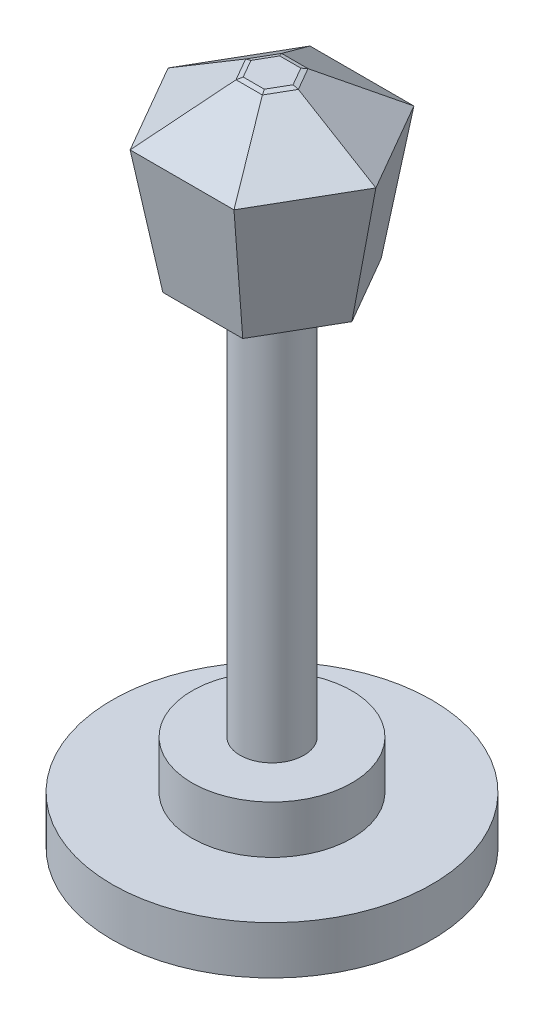
ISO-10303-21;
HEADER;
FILE_DESCRIPTION(('STEP AP214'),'2;1');
FILE_NAME('part.step','',(''),(''),'','','');
FILE_SCHEMA(('AUTOMOTIVE_DESIGN { 1 0 10303 214 1 1 1 1 }'));
ENDSEC;
DATA;
#1=APPLICATION_CONTEXT('core data for automotive mechanical design processes');
#2=APPLICATION_PROTOCOL_DEFINITION('international standard','automotive_design',2000,#1);
#3=PRODUCT_CONTEXT('',#1,'mechanical');
#4=PRODUCT('Part','Part','',(#3));
#5=PRODUCT_RELATED_PRODUCT_CATEGORY('part','',(#4));
#6=PRODUCT_DEFINITION_FORMATION('','',#4);
#7=PRODUCT_DEFINITION_CONTEXT('part definition',#1,'design');
#8=PRODUCT_DEFINITION('design','',#6,#7);
#9=PRODUCT_DEFINITION_SHAPE('','',#8);
#10=(LENGTH_UNIT() NAMED_UNIT(*) SI_UNIT(.MILLI.,.METRE.));
#11=(NAMED_UNIT(*) PLANE_ANGLE_UNIT() SI_UNIT($,.RADIAN.));
#12=(NAMED_UNIT(*) SI_UNIT($,.STERADIAN.) SOLID_ANGLE_UNIT());
#13=UNCERTAINTY_MEASURE_WITH_UNIT(LENGTH_MEASURE(1.E-05),#10,'distance_accuracy_value','');
#14=(GEOMETRIC_REPRESENTATION_CONTEXT(3) GLOBAL_UNCERTAINTY_ASSIGNED_CONTEXT((#13)) GLOBAL_UNIT_ASSIGNED_CONTEXT((#10,
#11,#12)) REPRESENTATION_CONTEXT('',''));
#15=CARTESIAN_POINT('',(0.,0.,0.));
#16=DIRECTION('',(0.,0.,1.));
#17=DIRECTION('',(1.,0.,0.));
#18=AXIS2_PLACEMENT_3D('',#15,#16,#17);
#19=CARTESIAN_POINT('',(-0.989654683712724,42.,-0.571377398046315));
#20=DIRECTION('',(-0.258363888348316,0.954461873656243,-0.149166460486779));
#21=DIRECTION('',(0.5,0.,-0.866025403784439));
#22=AXIS2_PLACEMENT_3D('',#19,#20,#21);
#23=PLANE('',#22);
#24=DIRECTION('',(-0.965261119531429,-0.2612871430456,0.));
#25=VECTOR('',#24,1.);
#26=CARTESIAN_POINT('',(-1.01217624582322,42.0832003748939,0.));
#27=LINE('',#26,#25);
#28=CARTESIAN_POINT('',(-1.31953957828364,42.,0.));
#29=VERTEX_POINT('',#28);
#30=CARTESIAN_POINT('',(-1.64833755289434,41.9109974682634,0.));
#31=VERTEX_POINT('',#30);
#32=EDGE_CURVE('E13',#29,#31,#27,.T.);
#33=ORIENTED_EDGE('',*,*,#32,.F.);
#34=DIRECTION('',(-0.5,0.,0.866025403784439));
#35=VECTOR('',#34,1.);
#36=CARTESIAN_POINT('',(-0.659769789141819,42.,-1.14275479609262));
#37=LINE('',#36,#35);
#38=CARTESIAN_POINT('',(-0.659769789141814,42.,-1.14275479609262));
#39=VERTEX_POINT('',#38);
#40=EDGE_CURVE('E306',#39,#29,#37,.T.);
#41=ORIENTED_EDGE('',*,*,#40,.F.);
#42=DIRECTION('',(-0.482630559765655,-0.261287143045588,-0.835940650799663));
#43=VECTOR('',#42,1.);
#44=CARTESIAN_POINT('',(-0.506088122911614,42.0832003748939,-0.876570341990005));
#45=LINE('',#44,#43);
#46=CARTESIAN_POINT('',(-0.824168776447167,41.9109974682634,-1.42750219481837));
#47=VERTEX_POINT('',#46);
#48=EDGE_CURVE('E72',#39,#47,#45,.T.);
#49=ORIENTED_EDGE('',*,*,#48,.T.);
#50=DIRECTION('',(0.5,0.,-0.866025403784439));
#51=VECTOR('',#50,1.);
#52=CARTESIAN_POINT('',(-0.906368270099853,41.9109974682634,-1.2851284954555));
#53=LINE('',#52,#51);
#54=EDGE_CURVE('E336',#31,#47,#53,.T.);
#55=ORIENTED_EDGE('',*,*,#54,.F.);
#56=EDGE_LOOP('',(#33,#41,#49,#55));
#57=FACE_BOUND('',#56,.T.);
#58=ADVANCED_FACE('F65',(#57),#23,.T.);
#59=CARTESIAN_POINT('',(0.,42.,-1.14275479609262));
#60=DIRECTION('',(0.,0.95446187365625,-0.298332920973534));
#61=DIRECTION('',(1.,0.,0.));
#62=AXIS2_PLACEMENT_3D('',#59,#60,#61);
#63=PLANE('',#62);
#64=ORIENTED_EDGE('',*,*,#48,.F.);
#65=DIRECTION('',(-1.,0.,0.));
#66=VECTOR('',#65,1.);
#67=CARTESIAN_POINT('',(0.659769789141829,42.,-1.14275479609262));
#68=LINE('',#67,#66);
#69=CARTESIAN_POINT('',(0.659769789141829,42.,-1.14275479609262));
#70=VERTEX_POINT('',#69);
#71=EDGE_CURVE('E309',#70,#39,#68,.T.);
#72=ORIENTED_EDGE('',*,*,#71,.F.);
#73=DIRECTION('',(0.482630559765639,-0.261287143045591,-0.835940650799672));
#74=VECTOR('',#73,1.);
#75=CARTESIAN_POINT('',(0.506088122911678,42.0832003748939,-0.876570341990058));
#76=LINE('',#75,#74);
#77=CARTESIAN_POINT('',(0.824168776447168,41.9109974682634,-1.42750219481837));
#78=VERTEX_POINT('',#77);
#79=EDGE_CURVE('E86',#70,#78,#76,.T.);
#80=ORIENTED_EDGE('',*,*,#79,.T.);
#81=DIRECTION('',(1.,0.,0.));
#82=VECTOR('',#81,1.);
#83=CARTESIAN_POINT('',(0.659769789141829,41.9109974682634,-1.42750219481837));
#84=LINE('',#83,#82);
#85=EDGE_CURVE('E334',#47,#78,#84,.T.);
#86=ORIENTED_EDGE('',*,*,#85,.F.);
#87=EDGE_LOOP('',(#64,#72,#80,#86));
#88=FACE_BOUND('',#87,.T.);
#89=ADVANCED_FACE('F372',(#88),#63,.T.);
#90=CARTESIAN_POINT('',(0.989654683712744,42.,-0.571377398046327));
#91=DIRECTION('',(0.258363888348321,0.954461873656241,-0.149166460486782));
#92=DIRECTION('',(0.5,0.,0.866025403784439));
#93=AXIS2_PLACEMENT_3D('',#90,#91,#92);
#94=PLANE('',#93);
#95=ORIENTED_EDGE('',*,*,#79,.F.);
#96=DIRECTION('',(-0.5,0.,-0.866025403784439));
#97=VECTOR('',#96,1.);
#98=CARTESIAN_POINT('',(1.31953957828365,42.,0.));
#99=LINE('',#98,#97);
#100=CARTESIAN_POINT('',(1.31953957828364,42.,0.));
#101=VERTEX_POINT('',#100);
#102=EDGE_CURVE('E313',#101,#70,#99,.T.);
#103=ORIENTED_EDGE('',*,*,#102,.F.);
#104=DIRECTION('',(0.965261119531429,-0.261287143045602,0.));
#105=VECTOR('',#104,1.);
#106=CARTESIAN_POINT('',(1.01217624582322,42.0832003748939,0.));
#107=LINE('',#106,#105);
#108=CARTESIAN_POINT('',(1.64833755289433,41.9109974682634,0.));
#109=VERTEX_POINT('',#108);
#110=EDGE_CURVE('E342',#101,#109,#107,.T.);
#111=ORIENTED_EDGE('',*,*,#110,.T.);
#112=DIRECTION('',(0.5,0.,0.866025403784439));
#113=VECTOR('',#112,1.);
#114=CARTESIAN_POINT('',(1.56613805924168,41.9109974682634,-0.142373699362884));
#115=LINE('',#114,#113);
#116=EDGE_CURVE('E331',#78,#109,#115,.T.);
#117=ORIENTED_EDGE('',*,*,#116,.F.);
#118=EDGE_LOOP('',(#95,#103,#111,#117));
#119=FACE_BOUND('',#118,.T.);
#120=ADVANCED_FACE('F347',(#119),#94,.T.);
#121=CARTESIAN_POINT('',(0.989654683712736,42.,0.571377398046321));
#122=DIRECTION('',(0.258363888348318,0.954461873656242,0.149166460486779));
#123=DIRECTION('',(-0.5,0.,0.866025403784439));
#124=AXIS2_PLACEMENT_3D('',#121,#122,#123);
#125=PLANE('',#124);
#126=ORIENTED_EDGE('',*,*,#110,.F.);
#127=DIRECTION('',(0.5,0.,-0.866025403784439));
#128=VECTOR('',#127,1.);
#129=CARTESIAN_POINT('',(0.659769789141829,42.,1.14275479609263));
#130=LINE('',#129,#128);
#131=CARTESIAN_POINT('',(0.659769789141824,42.,1.14275479609263));
#132=VERTEX_POINT('',#131);
#133=EDGE_CURVE('E316',#132,#101,#130,.T.);
#134=ORIENTED_EDGE('',*,*,#133,.F.);
#135=DIRECTION('',(0.482630559765714,-0.2612871430456,0.835940650799626));
#136=VECTOR('',#135,1.);
#137=CARTESIAN_POINT('',(0.506088122911612,42.0832003748939,0.876570341990067));
#138=LINE('',#137,#136);
#139=CARTESIAN_POINT('',(0.824168776447167,41.9109974682634,1.42750219481837));
#140=VERTEX_POINT('',#139);
#141=EDGE_CURVE('E340',#132,#140,#138,.T.);
#142=ORIENTED_EDGE('',*,*,#141,.T.);
#143=DIRECTION('',(-0.5,0.,0.866025403784439));
#144=VECTOR('',#143,1.);
#145=CARTESIAN_POINT('',(0.906368270099865,41.9109974682634,1.28512849545551));
#146=LINE('',#145,#144);
#147=EDGE_CURVE('E187',#109,#140,#146,.T.);
#148=ORIENTED_EDGE('',*,*,#147,.F.);
#149=EDGE_LOOP('',(#126,#134,#142,#148));
#150=FACE_BOUND('',#149,.T.);
#151=ADVANCED_FACE('F350',(#150),#125,.T.);
#152=CARTESIAN_POINT('',(0.,42.,1.14275479609264));
#153=DIRECTION('',(0.,0.954461873656242,0.298332920973559));
#154=DIRECTION('',(-1.,0.,0.));
#155=AXIS2_PLACEMENT_3D('',#152,#153,#154);
#156=PLANE('',#155);
#157=ORIENTED_EDGE('',*,*,#141,.F.);
#158=DIRECTION('',(1.,0.,0.));
#159=VECTOR('',#158,1.);
#160=CARTESIAN_POINT('',(-0.659769789141827,42.,1.14275479609264));
#161=LINE('',#160,#159);
#162=CARTESIAN_POINT('',(-0.659769789141827,42.,1.14275479609263));
#163=VERTEX_POINT('',#162);
#164=EDGE_CURVE('E319',#163,#132,#161,.T.);
#165=ORIENTED_EDGE('',*,*,#164,.F.);
#166=DIRECTION('',(-0.482630559765713,-0.2612871430456,0.835940650799626));
#167=VECTOR('',#166,1.);
#168=CARTESIAN_POINT('',(-0.506088122911618,42.0832003748939,0.876570341990063));
#169=LINE('',#168,#167);
#170=CARTESIAN_POINT('',(-0.824168776447167,41.9109974682634,1.42750219481837));
#171=VERTEX_POINT('',#170);
#172=EDGE_CURVE('E338',#163,#171,#169,.T.);
#173=ORIENTED_EDGE('',*,*,#172,.T.);
#174=DIRECTION('',(-1.,0.,0.));
#175=VECTOR('',#174,1.);
#176=CARTESIAN_POINT('',(-0.659769789141827,41.9109974682634,1.42750219481839));
#177=LINE('',#176,#175);
#178=EDGE_CURVE('E328',#140,#171,#177,.T.);
#179=ORIENTED_EDGE('',*,*,#178,.F.);
#180=EDGE_LOOP('',(#157,#165,#173,#179));
#181=FACE_BOUND('',#180,.T.);
#182=ADVANCED_FACE('F366',(#181),#156,.T.);
#183=CARTESIAN_POINT('',(-0.989654683712742,42.,0.571377398046325));
#184=DIRECTION('',(-0.258363888348318,0.954461873656242,0.14916646048678));
#185=DIRECTION('',(-0.5,0.,-0.866025403784439));
#186=AXIS2_PLACEMENT_3D('',#183,#184,#185);
#187=PLANE('',#186);
#188=DIRECTION('',(0.5,0.,0.866025403784439));
#189=VECTOR('',#188,1.);
#190=CARTESIAN_POINT('',(-1.31953957828364,42.,0.));
#191=LINE('',#190,#189);
#192=EDGE_CURVE('E322',#29,#163,#191,.T.);
#193=ORIENTED_EDGE('',*,*,#192,.F.);
#194=ORIENTED_EDGE('',*,*,#32,.T.);
#195=DIRECTION('',(-0.5,0.,-0.866025403784439));
#196=VECTOR('',#195,1.);
#197=CARTESIAN_POINT('',(-1.56613805924168,41.9109974682634,0.142373699362896));
#198=LINE('',#197,#196);
#199=EDGE_CURVE('E325',#171,#31,#198,.T.);
#200=ORIENTED_EDGE('',*,*,#199,.F.);
#201=ORIENTED_EDGE('',*,*,#172,.F.);
#202=EDGE_LOOP('',(#193,#194,#200,#201));
#203=FACE_BOUND('',#202,.T.);
#204=ADVANCED_FACE('F370',(#203),#187,.T.);
#205=CARTESIAN_POINT('',(0.,3.,0.));
#206=DIRECTION('',(0.,-1.,0.));
#207=DIRECTION('',(0.,0.,-1.));
#208=AXIS2_PLACEMENT_3D('',#205,#206,#207);
#209=CYLINDRICAL_SURFACE('',#208,10.);
#210=CARTESIAN_POINT('',(0.,3.,0.));
#211=DIRECTION('',(0.,1.,0.));
#212=DIRECTION('',(0.,0.,1.));
#213=AXIS2_PLACEMENT_3D('',#210,#211,#212);
#214=CIRCLE('',#213,10.);
#215=CARTESIAN_POINT('',(0.,3.,10.));
#216=VERTEX_POINT('',#215);
#217=EDGE_CURVE('E488',#216,#216,#214,.T.);
#218=ORIENTED_EDGE('',*,*,#217,.F.);
#219=EDGE_LOOP('',(#218));
#220=FACE_BOUND('',#219,.T.);
#221=CARTESIAN_POINT('',(0.,0.,0.));
#222=DIRECTION('',(0.,1.,0.));
#223=DIRECTION('',(0.,0.,1.));
#224=AXIS2_PLACEMENT_3D('',#221,#222,#223);
#225=CIRCLE('',#224,10.);
#226=CARTESIAN_POINT('',(0.,0.,10.));
#227=VERTEX_POINT('',#226);
#228=EDGE_CURVE('E485',#227,#227,#225,.T.);
#229=ORIENTED_EDGE('',*,*,#228,.T.);
#230=EDGE_LOOP('',(#229));
#231=FACE_BOUND('',#230,.T.);
#232=ADVANCED_FACE('F391',(#220,#231),#209,.T.);
#233=CARTESIAN_POINT('',(0.,3.,0.));
#234=DIRECTION('',(0.,1.,0.));
#235=DIRECTION('',(0.,0.,1.));
#236=AXIS2_PLACEMENT_3D('',#233,#234,#235);
#237=PLANE('',#236);
#238=CARTESIAN_POINT('',(0.,3.,0.));
#239=DIRECTION('',(0.,1.,0.));
#240=DIRECTION('',(0.,0.,1.));
#241=AXIS2_PLACEMENT_3D('',#238,#239,#240);
#242=CIRCLE('',#241,5.);
#243=CARTESIAN_POINT('',(0.,3.,5.));
#244=VERTEX_POINT('',#243);
#245=EDGE_CURVE('E482',#244,#244,#242,.T.);
#246=ORIENTED_EDGE('',*,*,#245,.F.);
#247=EDGE_LOOP('',(#246));
#248=FACE_BOUND('',#247,.T.);
#249=ORIENTED_EDGE('',*,*,#217,.T.);
#250=EDGE_LOOP('',(#249));
#251=FACE_BOUND('',#250,.T.);
#252=ADVANCED_FACE('F394',(#248,#251),#237,.T.);
#253=CARTESIAN_POINT('',(0.,0.,0.));
#254=DIRECTION('',(0.,1.,0.));
#255=DIRECTION('',(0.,0.,1.));
#256=AXIS2_PLACEMENT_3D('',#253,#254,#255);
#257=PLANE('',#256);
#258=ORIENTED_EDGE('',*,*,#228,.F.);
#259=EDGE_LOOP('',(#258));
#260=FACE_BOUND('',#259,.T.);
#261=ADVANCED_FACE('F396',(#260),#257,.F.);
#262=CARTESIAN_POINT('',(0.,6.,0.));
#263=DIRECTION('',(0.,-1.,0.));
#264=DIRECTION('',(0.,0.,-1.));
#265=AXIS2_PLACEMENT_3D('',#262,#263,#264);
#266=CYLINDRICAL_SURFACE('',#265,5.);
#267=CARTESIAN_POINT('',(0.,6.,0.));
#268=DIRECTION('',(0.,1.,0.));
#269=DIRECTION('',(0.,0.,1.));
#270=AXIS2_PLACEMENT_3D('',#267,#268,#269);
#271=CIRCLE('',#270,5.);
#272=CARTESIAN_POINT('',(0.,6.,5.));
#273=VERTEX_POINT('',#272);
#274=EDGE_CURVE('E479',#273,#273,#271,.T.);
#275=ORIENTED_EDGE('',*,*,#274,.F.);
#276=EDGE_LOOP('',(#275));
#277=FACE_BOUND('',#276,.T.);
#278=ORIENTED_EDGE('',*,*,#245,.T.);
#279=EDGE_LOOP('',(#278));
#280=FACE_BOUND('',#279,.T.);
#281=ADVANCED_FACE('F399',(#277,#280),#266,.T.);
#282=CARTESIAN_POINT('',(0.,6.,0.));
#283=DIRECTION('',(0.,1.,0.));
#284=DIRECTION('',(0.,0.,1.));
#285=AXIS2_PLACEMENT_3D('',#282,#283,#284);
#286=PLANE('',#285);
#287=CARTESIAN_POINT('',(0.,6.,0.));
#288=DIRECTION('',(0.,1.,0.));
#289=DIRECTION('',(0.,0.,1.));
#290=AXIS2_PLACEMENT_3D('',#287,#288,#289);
#291=CIRCLE('',#290,2.);
#292=CARTESIAN_POINT('',(0.,6.,2.));
#293=VERTEX_POINT('',#292);
#294=EDGE_CURVE('E310',#293,#293,#291,.T.);
#295=ORIENTED_EDGE('',*,*,#294,.F.);
#296=EDGE_LOOP('',(#295));
#297=FACE_BOUND('',#296,.T.);
#298=ORIENTED_EDGE('',*,*,#274,.T.);
#299=EDGE_LOOP('',(#298));
#300=FACE_BOUND('',#299,.T.);
#301=ADVANCED_FACE('F406',(#297,#300),#286,.T.);
#302=CARTESIAN_POINT('',(0.,31.,0.));
#303=DIRECTION('',(0.,-1.,0.));
#304=DIRECTION('',(0.,0.,-1.));
#305=AXIS2_PLACEMENT_3D('',#302,#303,#304);
#306=CYLINDRICAL_SURFACE('',#305,2.);
#307=CARTESIAN_POINT('',(0.,31.,0.));
#308=DIRECTION('',(0.,1.,0.));
#309=DIRECTION('',(0.,0.,1.));
#310=AXIS2_PLACEMENT_3D('',#307,#308,#309);
#311=CIRCLE('',#310,2.);
#312=CARTESIAN_POINT('',(0.,31.,2.));
#313=VERTEX_POINT('',#312);
#314=EDGE_CURVE('E471',#313,#313,#311,.T.);
#315=ORIENTED_EDGE('',*,*,#314,.F.);
#316=EDGE_LOOP('',(#315));
#317=FACE_BOUND('',#316,.T.);
#318=ORIENTED_EDGE('',*,*,#294,.T.);
#319=EDGE_LOOP('',(#318));
#320=FACE_BOUND('',#319,.T.);
#321=ADVANCED_FACE('F410',(#317,#320),#306,.T.);
#322=CARTESIAN_POINT('',(0.,31.,0.));
#323=DIRECTION('',(0.,1.,0.));
#324=DIRECTION('',(0.,0.,1.));
#325=AXIS2_PLACEMENT_3D('',#322,#323,#324);
#326=PLANE('',#325);
#327=ORIENTED_EDGE('',*,*,#314,.T.);
#328=EDGE_LOOP('',(#327));
#329=FACE_BOUND('',#328,.T.);
#330=DIRECTION('',(0.5,0.,-0.866025403784439));
#331=VECTOR('',#330,1.);
#332=CARTESIAN_POINT('',(2.5,31.,4.33012701892219));
#333=LINE('',#332,#331);
#334=CARTESIAN_POINT('',(2.5,31.,4.33012701892219));
#335=VERTEX_POINT('',#334);
#336=CARTESIAN_POINT('',(5.,31.,0.));
#337=VERTEX_POINT('',#336);
#338=EDGE_CURVE('E436',#335,#337,#333,.T.);
#339=ORIENTED_EDGE('',*,*,#338,.F.);
#340=DIRECTION('',(1.,0.,0.));
#341=VECTOR('',#340,1.);
#342=CARTESIAN_POINT('',(-2.5,31.,4.33012701892219));
#343=LINE('',#342,#341);
#344=CARTESIAN_POINT('',(-2.5,31.,4.33012701892219));
#345=VERTEX_POINT('',#344);
#346=EDGE_CURVE('E160',#345,#335,#343,.T.);
#347=ORIENTED_EDGE('',*,*,#346,.F.);
#348=DIRECTION('',(0.5,0.,0.866025403784439));
#349=VECTOR('',#348,1.);
#350=CARTESIAN_POINT('',(-5.,31.,0.));
#351=LINE('',#350,#349);
#352=CARTESIAN_POINT('',(-5.,31.,0.));
#353=VERTEX_POINT('',#352);
#354=EDGE_CURVE('E498',#353,#345,#351,.T.);
#355=ORIENTED_EDGE('',*,*,#354,.F.);
#356=DIRECTION('',(-0.5,0.,0.866025403784439));
#357=VECTOR('',#356,1.);
#358=CARTESIAN_POINT('',(-2.5,31.,-4.33012701892219));
#359=LINE('',#358,#357);
#360=CARTESIAN_POINT('',(-2.5,31.,-4.33012701892219));
#361=VERTEX_POINT('',#360);
#362=EDGE_CURVE('E503',#361,#353,#359,.T.);
#363=ORIENTED_EDGE('',*,*,#362,.F.);
#364=DIRECTION('',(-1.,0.,0.));
#365=VECTOR('',#364,1.);
#366=CARTESIAN_POINT('',(2.5,31.,-4.33012701892219));
#367=LINE('',#366,#365);
#368=CARTESIAN_POINT('',(2.5,31.,-4.33012701892219));
#369=VERTEX_POINT('',#368);
#370=EDGE_CURVE('E508',#369,#361,#367,.T.);
#371=ORIENTED_EDGE('',*,*,#370,.F.);
#372=DIRECTION('',(-0.5,0.,-0.866025403784439));
#373=VECTOR('',#372,1.);
#374=CARTESIAN_POINT('',(5.,31.,0.));
#375=LINE('',#374,#373);
#376=EDGE_CURVE('E494',#337,#369,#375,.T.);
#377=ORIENTED_EDGE('',*,*,#376,.F.);
#378=EDGE_LOOP('',(#339,#347,#355,#363,#371,#377));
#379=FACE_BOUND('',#378,.T.);
#380=ADVANCED_FACE('F414',(#329,#379),#326,.F.);
#381=CARTESIAN_POINT('',(0.593720266412955,0.111322549952429,0.342784555636856));
#382=DIRECTION('',(-0.854829009559898,-0.160280439292482,-0.493535758780508));
#383=DIRECTION('',(-0.5,0.,0.866025403784439));
#384=AXIS2_PLACEMENT_3D('',#381,#382,#383);
#385=PLANE('',#384);
#386=DIRECTION('',(0.0921442675250931,-0.982872186934322,0.15959855297968));
#387=VECTOR('',#386,1.);
#388=CARTESIAN_POINT('',(-3.25,39.,-5.62916512459885));
#389=LINE('',#388,#387);
#390=CARTESIAN_POINT('',(-3.25,39.,-5.62916512459885));
#391=VERTEX_POINT('',#390);
#392=EDGE_CURVE('E527',#391,#361,#389,.T.);
#393=ORIENTED_EDGE('',*,*,#392,.T.);
#394=ORIENTED_EDGE('',*,*,#362,.T.);
#395=DIRECTION('',(0.184288535050186,-0.982872186934322,0.));
#396=VECTOR('',#395,1.);
#397=CARTESIAN_POINT('',(-6.5,39.,0.));
#398=LINE('',#397,#396);
#399=CARTESIAN_POINT('',(-6.5,39.,0.));
#400=VERTEX_POINT('',#399);
#401=EDGE_CURVE('E447',#400,#353,#398,.T.);
#402=ORIENTED_EDGE('',*,*,#401,.F.);
#403=DIRECTION('',(-0.5,0.,0.866025403784439));
#404=VECTOR('',#403,1.);
#405=CARTESIAN_POINT('',(-3.25,39.,-5.62916512459885));
#406=LINE('',#405,#404);
#407=EDGE_CURVE('E264',#391,#400,#406,.T.);
#408=ORIENTED_EDGE('',*,*,#407,.F.);
#409=EDGE_LOOP('',(#393,#394,#402,#408));
#410=FACE_BOUND('',#409,.T.);
#411=ADVANCED_FACE('F418',(#410),#385,.T.);
#412=CARTESIAN_POINT('',(0.593720266412949,0.111322549952428,-0.342784555636852));
#413=DIRECTION('',(-0.854829009559898,-0.160280439292481,0.493535758780509));
#414=DIRECTION('',(0.5,0.,0.866025403784439));
#415=AXIS2_PLACEMENT_3D('',#412,#413,#414);
#416=PLANE('',#415);
#417=ORIENTED_EDGE('',*,*,#401,.T.);
#418=ORIENTED_EDGE('',*,*,#354,.T.);
#419=DIRECTION('',(0.0921442675250928,-0.982872186934322,-0.15959855297968));
#420=VECTOR('',#419,1.);
#421=CARTESIAN_POINT('',(-3.25,39.,5.62916512459885));
#422=LINE('',#421,#420);
#423=CARTESIAN_POINT('',(-3.25,39.,5.62916512459885));
#424=VERTEX_POINT('',#423);
#425=EDGE_CURVE('E164',#424,#345,#422,.T.);
#426=ORIENTED_EDGE('',*,*,#425,.F.);
#427=DIRECTION('',(0.5,0.,0.866025403784439));
#428=VECTOR('',#427,1.);
#429=CARTESIAN_POINT('',(-6.5,39.,0.));
#430=LINE('',#429,#428);
#431=EDGE_CURVE('E198',#400,#424,#430,.T.);
#432=ORIENTED_EDGE('',*,*,#431,.F.);
#433=EDGE_LOOP('',(#417,#418,#426,#432));
#434=FACE_BOUND('',#433,.T.);
#435=ADVANCED_FACE('F449',(#434),#416,.T.);
#436=CARTESIAN_POINT('',(0.,0.111322549952429,0.68556911127371));
#437=DIRECTION('',(0.,-0.160280439292481,-0.987071517561017));
#438=DIRECTION('',(0.,0.987071517561017,-0.160280439292481));
#439=AXIS2_PLACEMENT_3D('',#436,#437,#438);
#440=PLANE('',#439);
#441=DIRECTION('',(-0.0921442675250928,-0.982872186934322,0.15959855297968));
#442=VECTOR('',#441,1.);
#443=CARTESIAN_POINT('',(3.25,39.,-5.62916512459885));
#444=LINE('',#443,#442);
#445=CARTESIAN_POINT('',(3.25,39.,-5.62916512459885));
#446=VERTEX_POINT('',#445);
#447=EDGE_CURVE('E532',#446,#369,#444,.T.);
#448=ORIENTED_EDGE('',*,*,#447,.T.);
#449=ORIENTED_EDGE('',*,*,#370,.T.);
#450=ORIENTED_EDGE('',*,*,#392,.F.);
#451=DIRECTION('',(-1.,0.,0.));
#452=VECTOR('',#451,1.);
#453=CARTESIAN_POINT('',(3.25,39.,-5.62916512459885));
#454=LINE('',#453,#452);
#455=EDGE_CURVE('E246',#446,#391,#454,.T.);
#456=ORIENTED_EDGE('',*,*,#455,.F.);
#457=EDGE_LOOP('',(#448,#449,#450,#456));
#458=FACE_BOUND('',#457,.T.);
#459=ADVANCED_FACE('F458',(#458),#440,.T.);
#460=CARTESIAN_POINT('',(-0.593720266412947,0.111322549952428,0.342784555636851));
#461=DIRECTION('',(0.854829009559898,-0.160280439292481,-0.493535758780509));
#462=DIRECTION('',(-0.5,0.,-0.866025403784439));
#463=AXIS2_PLACEMENT_3D('',#460,#461,#462);
#464=PLANE('',#463);
#465=DIRECTION('',(-0.184288535050185,-0.982872186934322,0.));
#466=VECTOR('',#465,1.);
#467=CARTESIAN_POINT('',(6.5,39.,0.));
#468=LINE('',#467,#466);
#469=CARTESIAN_POINT('',(6.5,39.,0.));
#470=VERTEX_POINT('',#469);
#471=EDGE_CURVE('E165',#470,#337,#468,.T.);
#472=ORIENTED_EDGE('',*,*,#471,.T.);
#473=ORIENTED_EDGE('',*,*,#376,.T.);
#474=ORIENTED_EDGE('',*,*,#447,.F.);
#475=DIRECTION('',(-0.5,0.,-0.866025403784439));
#476=VECTOR('',#475,1.);
#477=CARTESIAN_POINT('',(6.5,39.,0.));
#478=LINE('',#477,#476);
#479=EDGE_CURVE('E303',#470,#446,#478,.T.);
#480=ORIENTED_EDGE('',*,*,#479,.F.);
#481=EDGE_LOOP('',(#472,#473,#474,#480));
#482=FACE_BOUND('',#481,.T.);
#483=ADVANCED_FACE('F462',(#482),#464,.T.);
#484=CARTESIAN_POINT('',(-0.593720266412948,0.111322549952428,-0.342784555636851));
#485=DIRECTION('',(0.854829009559899,-0.160280439292481,0.493535758780508));
#486=DIRECTION('',(0.5,0.,-0.866025403784439));
#487=AXIS2_PLACEMENT_3D('',#484,#485,#486);
#488=PLANE('',#487);
#489=DIRECTION('',(-0.0921442675250927,-0.982872186934322,-0.15959855297968));
#490=VECTOR('',#489,1.);
#491=CARTESIAN_POINT('',(3.25,39.,5.62916512459885));
#492=LINE('',#491,#490);
#493=CARTESIAN_POINT('',(3.25,39.,5.62916512459885));
#494=VERTEX_POINT('',#493);
#495=EDGE_CURVE('E152',#494,#335,#492,.T.);
#496=ORIENTED_EDGE('',*,*,#495,.T.);
#497=ORIENTED_EDGE('',*,*,#338,.T.);
#498=ORIENTED_EDGE('',*,*,#471,.F.);
#499=DIRECTION('',(0.499999999999999,0.,-0.866025403784439));
#500=VECTOR('',#499,1.);
#501=CARTESIAN_POINT('',(3.25,39.,5.62916512459885));
#502=LINE('',#501,#500);
#503=EDGE_CURVE('E168',#494,#470,#502,.T.);
#504=ORIENTED_EDGE('',*,*,#503,.F.);
#505=EDGE_LOOP('',(#496,#497,#498,#504));
#506=FACE_BOUND('',#505,.T.);
#507=ADVANCED_FACE('F171',(#506),#488,.T.);
#508=CARTESIAN_POINT('',(0.,0.111322549952429,-0.685569111273709));
#509=DIRECTION('',(0.,-0.160280439292481,0.987071517561017));
#510=DIRECTION('',(0.,-0.987071517561017,-0.160280439292481));
#511=AXIS2_PLACEMENT_3D('',#508,#509,#510);
#512=PLANE('',#511);
#513=ORIENTED_EDGE('',*,*,#425,.T.);
#514=ORIENTED_EDGE('',*,*,#346,.T.);
#515=ORIENTED_EDGE('',*,*,#495,.F.);
#516=DIRECTION('',(1.,0.,0.));
#517=VECTOR('',#516,1.);
#518=CARTESIAN_POINT('',(-3.25,39.,5.62916512459885));
#519=LINE('',#518,#517);
#520=EDGE_CURVE('E157',#424,#494,#519,.T.);
#521=ORIENTED_EDGE('',*,*,#520,.F.);
#522=EDGE_LOOP('',(#513,#514,#515,#521));
#523=FACE_BOUND('',#522,.T.);
#524=ADVANCED_FACE('F155',(#523),#512,.T.);
#525=CARTESIAN_POINT('',(0.,42.,0.));
#526=DIRECTION('',(0.,1.,0.));
#527=DIRECTION('',(0.,0.,1.));
#528=AXIS2_PLACEMENT_3D('',#525,#526,#527);
#529=PLANE('',#528);
#530=ORIENTED_EDGE('',*,*,#40,.T.);
#531=ORIENTED_EDGE('',*,*,#192,.T.);
#532=ORIENTED_EDGE('',*,*,#164,.T.);
#533=ORIENTED_EDGE('',*,*,#133,.T.);
#534=ORIENTED_EDGE('',*,*,#102,.T.);
#535=ORIENTED_EDGE('',*,*,#71,.T.);
#536=EDGE_LOOP('',(#530,#531,#532,#533,#534,#535));
#537=FACE_BOUND('',#536,.T.);
#538=ADVANCED_FACE('F284',(#537),#529,.T.);
#539=CARTESIAN_POINT('',(17.3918918918919,28.9864864864865,10.0412134655006));
#540=DIRECTION('',(-0.493196961916072,-0.821994936526786,-0.28474739872575));
#541=DIRECTION('',(0.857492925712544,-0.514495755427527,0.));
#542=AXIS2_PLACEMENT_3D('',#539,#540,#541);
#543=PLANE('',#542);
#544=DIRECTION('',(-0.857492925712544,0.514495755427527,0.));
#545=VECTOR('',#544,1.);
#546=CARTESIAN_POINT('',(6.5,39.,0.));
#547=LINE('',#546,#545);
#548=EDGE_CURVE('E192',#470,#109,#547,.T.);
#549=ORIENTED_EDGE('',*,*,#548,.T.);
#550=ORIENTED_EDGE('',*,*,#147,.T.);
#551=DIRECTION('',(-0.428746462856272,0.514495755427527,-0.742610657232506));
#552=VECTOR('',#551,1.);
#553=CARTESIAN_POINT('',(3.25,39.,5.62916512459885));
#554=LINE('',#553,#552);
#555=EDGE_CURVE('E184',#494,#140,#554,.T.);
#556=ORIENTED_EDGE('',*,*,#555,.F.);
#557=ORIENTED_EDGE('',*,*,#503,.T.);
#558=EDGE_LOOP('',(#549,#550,#556,#557));
#559=FACE_BOUND('',#558,.T.);
#560=ADVANCED_FACE('F185',(#559),#543,.F.);
#561=CARTESIAN_POINT('',(0.,28.9864864864865,20.0824269310013));
#562=DIRECTION('',(0.,-0.821994936526786,-0.5694947974515));
#563=DIRECTION('',(0.,0.5694947974515,-0.821994936526786));
#564=AXIS2_PLACEMENT_3D('',#561,#562,#563);
#565=PLANE('',#564);
#566=ORIENTED_EDGE('',*,*,#555,.T.);
#567=ORIENTED_EDGE('',*,*,#178,.T.);
#568=DIRECTION('',(0.428746462856272,0.514495755427527,-0.742610657232506));
#569=VECTOR('',#568,1.);
#570=CARTESIAN_POINT('',(-3.25,39.,5.62916512459885));
#571=LINE('',#570,#569);
#572=EDGE_CURVE('E178',#424,#171,#571,.T.);
#573=ORIENTED_EDGE('',*,*,#572,.F.);
#574=ORIENTED_EDGE('',*,*,#520,.T.);
#575=EDGE_LOOP('',(#566,#567,#573,#574));
#576=FACE_BOUND('',#575,.T.);
#577=ADVANCED_FACE('F196',(#576),#565,.F.);
#578=CARTESIAN_POINT('',(17.3918918918919,28.9864864864865,-10.0412134655007));
#579=DIRECTION('',(-0.493196961916072,-0.821994936526786,0.28474739872575));
#580=DIRECTION('',(0.857492925712544,-0.514495755427527,0.));
#581=AXIS2_PLACEMENT_3D('',#578,#579,#580);
#582=PLANE('',#581);
#583=DIRECTION('',(-0.428746462856272,0.514495755427527,0.742610657232506));
#584=VECTOR('',#583,1.);
#585=CARTESIAN_POINT('',(3.25,39.,-5.62916512459885));
#586=LINE('',#585,#584);
#587=EDGE_CURVE('E191',#446,#78,#586,.T.);
#588=ORIENTED_EDGE('',*,*,#587,.T.);
#589=ORIENTED_EDGE('',*,*,#116,.T.);
#590=ORIENTED_EDGE('',*,*,#548,.F.);
#591=ORIENTED_EDGE('',*,*,#479,.T.);
#592=EDGE_LOOP('',(#588,#589,#590,#591));
#593=FACE_BOUND('',#592,.T.);
#594=ADVANCED_FACE('F215',(#593),#582,.F.);
#595=CARTESIAN_POINT('',(0.,28.9864864864865,-20.0824269310013));
#596=DIRECTION('',(0.,-0.821994936526786,0.5694947974515));
#597=DIRECTION('',(0.,-0.5694947974515,-0.821994936526786));
#598=AXIS2_PLACEMENT_3D('',#595,#596,#597);
#599=PLANE('',#598);
#600=DIRECTION('',(0.428746462856272,0.514495755427527,0.742610657232506));
#601=VECTOR('',#600,1.);
#602=CARTESIAN_POINT('',(-3.25,39.,-5.62916512459885));
#603=LINE('',#602,#601);
#604=EDGE_CURVE('E238',#391,#47,#603,.T.);
#605=ORIENTED_EDGE('',*,*,#604,.T.);
#606=ORIENTED_EDGE('',*,*,#85,.T.);
#607=ORIENTED_EDGE('',*,*,#587,.F.);
#608=ORIENTED_EDGE('',*,*,#455,.T.);
#609=EDGE_LOOP('',(#605,#606,#607,#608));
#610=FACE_BOUND('',#609,.T.);
#611=ADVANCED_FACE('F220',(#610),#599,.F.);
#612=CARTESIAN_POINT('',(-17.3918918918919,28.9864864864865,-10.0412134655007));
#613=DIRECTION('',(0.493196961916072,-0.821994936526786,0.28474739872575));
#614=DIRECTION('',(0.857492925712544,0.514495755427527,0.));
#615=AXIS2_PLACEMENT_3D('',#612,#613,#614);
#616=PLANE('',#615);
#617=DIRECTION('',(0.857492925712544,0.514495755427527,0.));
#618=VECTOR('',#617,1.);
#619=CARTESIAN_POINT('',(-6.5,39.,0.));
#620=LINE('',#619,#618);
#621=EDGE_CURVE('E257',#400,#31,#620,.T.);
#622=ORIENTED_EDGE('',*,*,#621,.T.);
#623=ORIENTED_EDGE('',*,*,#54,.T.);
#624=ORIENTED_EDGE('',*,*,#604,.F.);
#625=ORIENTED_EDGE('',*,*,#407,.T.);
#626=EDGE_LOOP('',(#622,#623,#624,#625));
#627=FACE_BOUND('',#626,.T.);
#628=ADVANCED_FACE('F270',(#627),#616,.F.);
#629=CARTESIAN_POINT('',(-17.3918918918919,28.9864864864865,10.0412134655007));
#630=DIRECTION('',(0.493196961916072,-0.821994936526786,-0.28474739872575));
#631=DIRECTION('',(0.857492925712544,0.514495755427527,0.));
#632=AXIS2_PLACEMENT_3D('',#629,#630,#631);
#633=PLANE('',#632);
#634=ORIENTED_EDGE('',*,*,#572,.T.);
#635=ORIENTED_EDGE('',*,*,#199,.T.);
#636=ORIENTED_EDGE('',*,*,#621,.F.);
#637=ORIENTED_EDGE('',*,*,#431,.T.);
#638=EDGE_LOOP('',(#634,#635,#636,#637));
#639=FACE_BOUND('',#638,.T.);
#640=ADVANCED_FACE('F279',(#639),#633,.F.);
#641=CLOSED_SHELL('',(#58,#89,#120,#151,#182,#204,#232,#252,#261,#281,#301,#321,#380,#411,#435,
#459,#483,#507,#524,#538,#560,#577,#594,#611,#628,#640));
#642=MANIFOLD_SOLID_BREP('B2',#641);
#643=ADVANCED_BREP_SHAPE_REPRESENTATION('',(#18,#642),#14);
#644=SHAPE_DEFINITION_REPRESENTATION(#9,#643);
ENDSEC;
END-ISO-10303-21;
